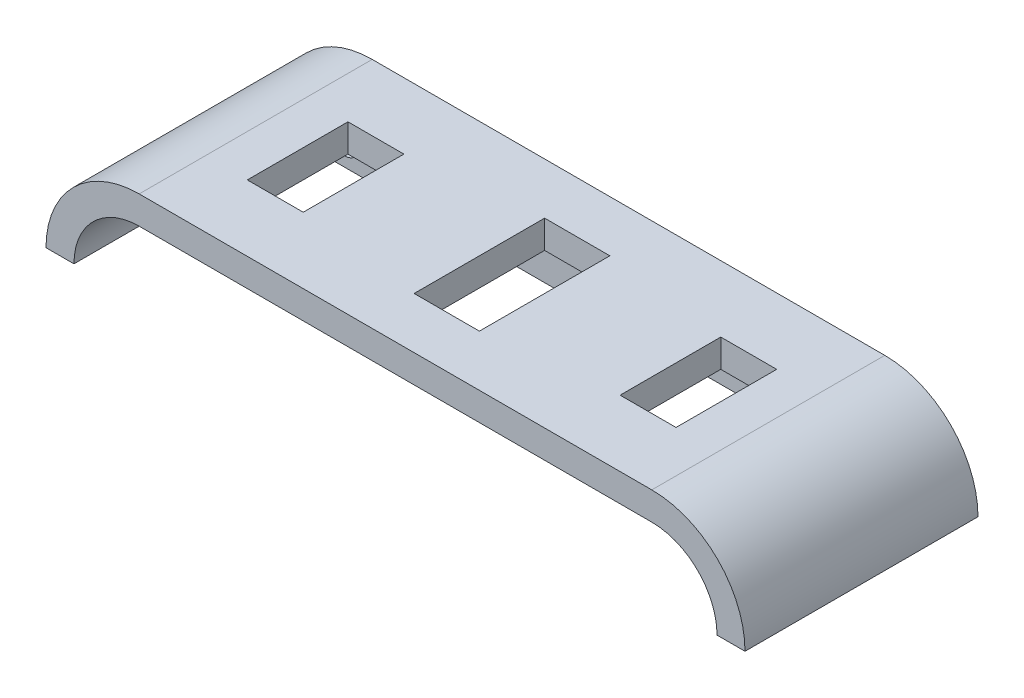
ISO-10303-21;
HEADER;
FILE_DESCRIPTION(('STEP AP214'),'2;1');
FILE_NAME('part.step','',(''),(''),'','','');
FILE_SCHEMA(('AUTOMOTIVE_DESIGN { 1 0 10303 214 1 1 1 1 }'));
ENDSEC;
DATA;
#1=APPLICATION_CONTEXT('core data for automotive mechanical design processes');
#2=APPLICATION_PROTOCOL_DEFINITION('international standard','automotive_design',2000,#1);
#3=PRODUCT_CONTEXT('',#1,'mechanical');
#4=PRODUCT('Part','Part','',(#3));
#5=PRODUCT_RELATED_PRODUCT_CATEGORY('part','',(#4));
#6=PRODUCT_DEFINITION_FORMATION('','',#4);
#7=PRODUCT_DEFINITION_CONTEXT('part definition',#1,'design');
#8=PRODUCT_DEFINITION('design','',#6,#7);
#9=PRODUCT_DEFINITION_SHAPE('','',#8);
#10=(LENGTH_UNIT() NAMED_UNIT(*) SI_UNIT(.MILLI.,.METRE.));
#11=(NAMED_UNIT(*) PLANE_ANGLE_UNIT() SI_UNIT($,.RADIAN.));
#12=(NAMED_UNIT(*) SI_UNIT($,.STERADIAN.) SOLID_ANGLE_UNIT());
#13=UNCERTAINTY_MEASURE_WITH_UNIT(LENGTH_MEASURE(1.E-05),#10,'distance_accuracy_value','');
#14=(GEOMETRIC_REPRESENTATION_CONTEXT(3) GLOBAL_UNCERTAINTY_ASSIGNED_CONTEXT((#13)) GLOBAL_UNIT_ASSIGNED_CONTEXT((#10,
#11,#12)) REPRESENTATION_CONTEXT('',''));
#15=CARTESIAN_POINT('',(0.,0.,0.));
#16=DIRECTION('',(0.,0.,1.));
#17=DIRECTION('',(1.,0.,0.));
#18=AXIS2_PLACEMENT_3D('',#15,#16,#17);
#19=CARTESIAN_POINT('',(-54.2252173913044,6.45366459627332,25.));
#20=DIRECTION('',(0.,0.,-1.));
#21=DIRECTION('',(-1.,0.,0.));
#22=AXIS2_PLACEMENT_3D('',#19,#20,#21);
#23=CYLINDRICAL_SURFACE('',#22,6.99999999999996);
#24=DIRECTION('',(0.,0.,-1.));
#25=VECTOR('',#24,1.);
#26=CARTESIAN_POINT('',(-61.062614556893,7.9536645962733,3.));
#27=LINE('',#26,#25);
#28=CARTESIAN_POINT('',(-61.062614556893,7.9536645962733,3.));
#29=VERTEX_POINT('',#28);
#30=CARTESIAN_POINT('',(-61.062614556893,7.9536645962733,0.));
#31=VERTEX_POINT('',#30);
#32=EDGE_CURVE('E309',#29,#31,#27,.T.);
#33=ORIENTED_EDGE('',*,*,#32,.F.);
#34=CARTESIAN_POINT('',(-54.2252173913044,6.45366459627332,3.));
#35=DIRECTION('',(0.,0.,1.));
#36=DIRECTION('',(-1.,0.,0.));
#37=AXIS2_PLACEMENT_3D('',#34,#35,#36);
#38=CIRCLE('',#37,6.99999999999997);
#39=CARTESIAN_POINT('',(-54.2252173913044,13.4536645962733,3.));
#40=VERTEX_POINT('',#39);
#41=EDGE_CURVE('E293',#40,#29,#38,.T.);
#42=ORIENTED_EDGE('',*,*,#41,.F.);
#43=DIRECTION('',(0.,0.,-1.));
#44=VECTOR('',#43,1.);
#45=CARTESIAN_POINT('',(-54.2252173913044,13.4536645962733,25.));
#46=LINE('',#45,#44);
#47=CARTESIAN_POINT('',(-54.2252173913044,13.4536645962733,25.));
#48=VERTEX_POINT('',#47);
#49=EDGE_CURVE('E359',#48,#40,#46,.T.);
#50=ORIENTED_EDGE('',*,*,#49,.F.);
#51=CARTESIAN_POINT('',(-54.2252173913044,6.45366459627332,25.));
#52=DIRECTION('',(0.,0.,-1.));
#53=DIRECTION('',(-1.,0.,0.));
#54=AXIS2_PLACEMENT_3D('',#51,#52,#53);
#55=CIRCLE('',#54,6.99999999999996);
#56=CARTESIAN_POINT('',(-61.2252173913044,6.45366459627331,25.));
#57=VERTEX_POINT('',#56);
#58=EDGE_CURVE('E319',#57,#48,#55,.T.);
#59=ORIENTED_EDGE('',*,*,#58,.F.);
#60=DIRECTION('',(0.,0.,-1.));
#61=VECTOR('',#60,1.);
#62=CARTESIAN_POINT('',(-61.2252173913044,6.45366459627331,25.));
#63=LINE('',#62,#61);
#64=CARTESIAN_POINT('',(-61.2252173913044,6.45366459627331,0.));
#65=VERTEX_POINT('',#64);
#66=EDGE_CURVE('E48',#57,#65,#63,.T.);
#67=ORIENTED_EDGE('',*,*,#66,.T.);
#68=CARTESIAN_POINT('',(-54.2252173913044,6.45366459627332,0.));
#69=DIRECTION('',(0.,0.,-1.));
#70=DIRECTION('',(-1.,0.,0.));
#71=AXIS2_PLACEMENT_3D('',#68,#69,#70);
#72=CIRCLE('',#71,6.99999999999996);
#73=EDGE_CURVE('E336',#65,#31,#72,.T.);
#74=ORIENTED_EDGE('',*,*,#73,.T.);
#75=EDGE_LOOP('',(#33,#42,#50,#59,#67,#74));
#76=FACE_BOUND('',#75,.T.);
#77=ADVANCED_FACE('F39',(#76),#23,.F.);
#78=CARTESIAN_POINT('',(-54.2252173913044,13.4536645962733,25.));
#79=DIRECTION('',(0.,1.,0.));
#80=DIRECTION('',(0.,0.,1.));
#81=AXIS2_PLACEMENT_3D('',#78,#79,#80);
#82=PLANE('',#81);
#83=DIRECTION('',(-1.,0.,0.));
#84=VECTOR('',#83,1.);
#85=CARTESIAN_POINT('',(-54.2252173913044,13.4536645962733,7.1));
#86=LINE('',#85,#84);
#87=CARTESIAN_POINT('',(-3.72521739130438,13.4536645962733,7.1));
#88=VERTEX_POINT('',#87);
#89=CARTESIAN_POINT('',(-9.72521739130438,13.4536645962733,7.1));
#90=VERTEX_POINT('',#89);
#91=EDGE_CURVE('E286',#88,#90,#86,.T.);
#92=ORIENTED_EDGE('',*,*,#91,.T.);
#93=DIRECTION('',(0.,0.,1.));
#94=VECTOR('',#93,1.);
#95=CARTESIAN_POINT('',(-9.72521739130438,13.4536645962733,25.));
#96=LINE('',#95,#94);
#97=CARTESIAN_POINT('',(-9.72521739130438,13.4536645962733,17.9));
#98=VERTEX_POINT('',#97);
#99=EDGE_CURVE('E289',#90,#98,#96,.T.);
#100=ORIENTED_EDGE('',*,*,#99,.T.);
#101=DIRECTION('',(1.,0.,0.));
#102=VECTOR('',#101,1.);
#103=CARTESIAN_POINT('',(-54.2252173913044,13.4536645962733,17.9));
#104=LINE('',#103,#102);
#105=CARTESIAN_POINT('',(-3.72521739130438,13.4536645962733,17.9));
#106=VERTEX_POINT('',#105);
#107=EDGE_CURVE('E283',#98,#106,#104,.T.);
#108=ORIENTED_EDGE('',*,*,#107,.T.);
#109=DIRECTION('',(0.,0.,-1.));
#110=VECTOR('',#109,1.);
#111=CARTESIAN_POINT('',(-3.72521739130438,13.4536645962733,25.));
#112=LINE('',#111,#110);
#113=EDGE_CURVE('E195',#106,#88,#112,.T.);
#114=ORIENTED_EDGE('',*,*,#113,.T.);
#115=EDGE_LOOP('',(#92,#100,#108,#114));
#116=FACE_BOUND('',#115,.T.);
#117=DIRECTION('',(-1.,0.,0.));
#118=VECTOR('',#117,1.);
#119=CARTESIAN_POINT('',(-54.2252173913044,13.4536645962733,7.1));
#120=LINE('',#119,#118);
#121=CARTESIAN_POINT('',(-43.7252173913044,13.4536645962733,7.1));
#122=VERTEX_POINT('',#121);
#123=CARTESIAN_POINT('',(-49.7252173913044,13.4536645962733,7.1));
#124=VERTEX_POINT('',#123);
#125=EDGE_CURVE('E277',#122,#124,#120,.T.);
#126=ORIENTED_EDGE('',*,*,#125,.T.);
#127=DIRECTION('',(0.,0.,1.));
#128=VECTOR('',#127,1.);
#129=CARTESIAN_POINT('',(-49.7252173913044,13.4536645962733,25.));
#130=LINE('',#129,#128);
#131=CARTESIAN_POINT('',(-49.7252173913044,13.4536645962733,17.9));
#132=VERTEX_POINT('',#131);
#133=EDGE_CURVE('E280',#124,#132,#130,.T.);
#134=ORIENTED_EDGE('',*,*,#133,.T.);
#135=DIRECTION('',(1.,0.,0.));
#136=VECTOR('',#135,1.);
#137=CARTESIAN_POINT('',(-54.2252173913044,13.4536645962733,17.9));
#138=LINE('',#137,#136);
#139=CARTESIAN_POINT('',(-43.7252173913044,13.4536645962733,17.9));
#140=VERTEX_POINT('',#139);
#141=EDGE_CURVE('E271',#132,#140,#138,.T.);
#142=ORIENTED_EDGE('',*,*,#141,.T.);
#143=DIRECTION('',(0.,0.,-1.));
#144=VECTOR('',#143,1.);
#145=CARTESIAN_POINT('',(-43.7252173913044,13.4536645962733,25.));
#146=LINE('',#145,#144);
#147=EDGE_CURVE('E274',#140,#122,#146,.T.);
#148=ORIENTED_EDGE('',*,*,#147,.T.);
#149=EDGE_LOOP('',(#126,#134,#142,#148));
#150=FACE_BOUND('',#149,.T.);
#151=DIRECTION('',(-1.,0.,0.));
#152=VECTOR('',#151,1.);
#153=CARTESIAN_POINT('',(-54.2252173913044,13.4536645962733,5.50000000000001));
#154=LINE('',#153,#152);
#155=CARTESIAN_POINT('',(-23.2252173913044,13.4536645962733,5.50000000000001));
#156=VERTEX_POINT('',#155);
#157=CARTESIAN_POINT('',(-30.2252173913044,13.4536645962733,5.50000000000001));
#158=VERTEX_POINT('',#157);
#159=EDGE_CURVE('E265',#156,#158,#154,.T.);
#160=ORIENTED_EDGE('',*,*,#159,.T.);
#161=DIRECTION('',(0.,0.,1.));
#162=VECTOR('',#161,1.);
#163=CARTESIAN_POINT('',(-30.2252173913044,13.4536645962733,25.));
#164=LINE('',#163,#162);
#165=CARTESIAN_POINT('',(-30.2252173913044,13.4536645962733,19.5));
#166=VERTEX_POINT('',#165);
#167=EDGE_CURVE('E268',#158,#166,#164,.T.);
#168=ORIENTED_EDGE('',*,*,#167,.T.);
#169=DIRECTION('',(1.,0.,0.));
#170=VECTOR('',#169,1.);
#171=CARTESIAN_POINT('',(-54.2252173913044,13.4536645962733,19.5));
#172=LINE('',#171,#170);
#173=CARTESIAN_POINT('',(-23.2252173913044,13.4536645962733,19.5));
#174=VERTEX_POINT('',#173);
#175=EDGE_CURVE('E219',#166,#174,#172,.T.);
#176=ORIENTED_EDGE('',*,*,#175,.T.);
#177=DIRECTION('',(0.,0.,-1.));
#178=VECTOR('',#177,1.);
#179=CARTESIAN_POINT('',(-23.2252173913044,13.4536645962733,25.));
#180=LINE('',#179,#178);
#181=EDGE_CURVE('E262',#174,#156,#180,.T.);
#182=ORIENTED_EDGE('',*,*,#181,.T.);
#183=EDGE_LOOP('',(#160,#168,#176,#182));
#184=FACE_BOUND('',#183,.T.);
#185=DIRECTION('',(-1.,0.,0.));
#186=VECTOR('',#185,1.);
#187=CARTESIAN_POINT('',(-54.2252173913044,13.4536645962733,3.));
#188=LINE('',#187,#186);
#189=CARTESIAN_POINT('',(0.774782608695637,13.4536645962733,3.));
#190=VERTEX_POINT('',#189);
#191=EDGE_CURVE('E302',#190,#40,#188,.T.);
#192=ORIENTED_EDGE('',*,*,#191,.F.);
#193=DIRECTION('',(0.,0.,-1.));
#194=VECTOR('',#193,1.);
#195=CARTESIAN_POINT('',(0.774782608695637,13.4536645962733,25.));
#196=LINE('',#195,#194);
#197=CARTESIAN_POINT('',(0.774782608695637,13.4536645962733,25.));
#198=VERTEX_POINT('',#197);
#199=EDGE_CURVE('E356',#198,#190,#196,.T.);
#200=ORIENTED_EDGE('',*,*,#199,.F.);
#201=DIRECTION('',(1.,0.,0.));
#202=VECTOR('',#201,1.);
#203=CARTESIAN_POINT('',(-54.2252173913044,13.4536645962733,25.));
#204=LINE('',#203,#202);
#205=EDGE_CURVE('E321',#48,#198,#204,.T.);
#206=ORIENTED_EDGE('',*,*,#205,.F.);
#207=ORIENTED_EDGE('',*,*,#49,.T.);
#208=EDGE_LOOP('',(#192,#200,#206,#207));
#209=FACE_BOUND('',#208,.T.);
#210=ADVANCED_FACE('F389',(#116,#150,#184,#209),#82,.F.);
#211=CARTESIAN_POINT('',(0.77478260869563,6.45366459627325,25.));
#212=DIRECTION('',(0.,0.,-1.));
#213=DIRECTION('',(-1.,0.,0.));
#214=AXIS2_PLACEMENT_3D('',#211,#212,#213);
#215=CYLINDRICAL_SURFACE('',#214,7.00000000000003);
#216=DIRECTION('',(0.,0.,-1.));
#217=VECTOR('',#216,1.);
#218=CARTESIAN_POINT('',(7.61217977428432,7.9536645962733,3.));
#219=LINE('',#218,#217);
#220=CARTESIAN_POINT('',(7.61217977428432,7.9536645962733,3.));
#221=VERTEX_POINT('',#220);
#222=CARTESIAN_POINT('',(7.61217977428432,7.9536645962733,0.));
#223=VERTEX_POINT('',#222);
#224=EDGE_CURVE('E305',#221,#223,#219,.T.);
#225=ORIENTED_EDGE('',*,*,#224,.T.);
#226=CARTESIAN_POINT('',(0.77478260869563,6.45366459627325,0.));
#227=DIRECTION('',(0.,0.,-1.));
#228=DIRECTION('',(1.,0.,0.));
#229=AXIS2_PLACEMENT_3D('',#226,#227,#228);
#230=CIRCLE('',#229,7.00000000000003);
#231=CARTESIAN_POINT('',(7.77478260869566,6.45366459627329,0.));
#232=VERTEX_POINT('',#231);
#233=EDGE_CURVE('E338',#223,#232,#230,.T.);
#234=ORIENTED_EDGE('',*,*,#233,.T.);
#235=DIRECTION('',(0.,0.,-1.));
#236=VECTOR('',#235,1.);
#237=CARTESIAN_POINT('',(7.77478260869566,6.45366459627329,25.));
#238=LINE('',#237,#236);
#239=CARTESIAN_POINT('',(7.77478260869566,6.45366459627329,25.));
#240=VERTEX_POINT('',#239);
#241=EDGE_CURVE('E353',#240,#232,#238,.T.);
#242=ORIENTED_EDGE('',*,*,#241,.F.);
#243=CARTESIAN_POINT('',(0.77478260869563,6.45366459627325,25.));
#244=DIRECTION('',(0.,0.,-1.));
#245=DIRECTION('',(1.,0.,0.));
#246=AXIS2_PLACEMENT_3D('',#243,#244,#245);
#247=CIRCLE('',#246,7.00000000000003);
#248=EDGE_CURVE('E323',#198,#240,#247,.T.);
#249=ORIENTED_EDGE('',*,*,#248,.F.);
#250=ORIENTED_EDGE('',*,*,#199,.T.);
#251=CARTESIAN_POINT('',(0.77478260869563,6.45366459627325,3.));
#252=DIRECTION('',(0.,0.,1.));
#253=DIRECTION('',(1.,0.,0.));
#254=AXIS2_PLACEMENT_3D('',#251,#252,#253);
#255=CIRCLE('',#254,7.00000000000003);
#256=EDGE_CURVE('E299',#221,#190,#255,.T.);
#257=ORIENTED_EDGE('',*,*,#256,.F.);
#258=EDGE_LOOP('',(#225,#234,#242,#249,#250,#257));
#259=FACE_BOUND('',#258,.T.);
#260=ADVANCED_FACE('F397',(#259),#215,.F.);
#261=CARTESIAN_POINT('',(-54.2252173913044,6.45366459627329,25.));
#262=DIRECTION('',(0.,0.,-1.));
#263=DIRECTION('',(-1.,0.,0.));
#264=AXIS2_PLACEMENT_3D('',#261,#262,#263);
#265=CYLINDRICAL_SURFACE('',#264,9.99999999999999);
#266=CARTESIAN_POINT('',(-54.2252173913044,6.45366459627329,0.));
#267=DIRECTION('',(0.,0.,1.));
#268=DIRECTION('',(-1.,0.,0.));
#269=AXIS2_PLACEMENT_3D('',#266,#267,#268);
#270=CIRCLE('',#269,9.99999999999999);
#271=CARTESIAN_POINT('',(-54.2252173913044,16.4536645962733,0.));
#272=VERTEX_POINT('',#271);
#273=CARTESIAN_POINT('',(-64.2252173913044,6.45366459627329,0.));
#274=VERTEX_POINT('',#273);
#275=EDGE_CURVE('E312',#272,#274,#270,.T.);
#276=ORIENTED_EDGE('',*,*,#275,.T.);
#277=DIRECTION('',(0.,0.,-1.));
#278=VECTOR('',#277,1.);
#279=CARTESIAN_POINT('',(-64.2252173913044,6.45366459627329,25.));
#280=LINE('',#279,#278);
#281=CARTESIAN_POINT('',(-64.2252173913044,6.45366459627329,25.));
#282=VERTEX_POINT('',#281);
#283=EDGE_CURVE('E11',#282,#274,#280,.T.);
#284=ORIENTED_EDGE('',*,*,#283,.F.);
#285=CARTESIAN_POINT('',(-54.2252173913044,6.45366459627329,25.));
#286=DIRECTION('',(0.,0.,1.));
#287=DIRECTION('',(-1.,0.,0.));
#288=AXIS2_PLACEMENT_3D('',#285,#286,#287);
#289=CIRCLE('',#288,9.99999999999999);
#290=CARTESIAN_POINT('',(-54.2252173913044,16.4536645962733,25.));
#291=VERTEX_POINT('',#290);
#292=EDGE_CURVE('E313',#291,#282,#289,.T.);
#293=ORIENTED_EDGE('',*,*,#292,.F.);
#294=DIRECTION('',(0.,0.,-1.));
#295=VECTOR('',#294,1.);
#296=CARTESIAN_POINT('',(-54.2252173913044,16.4536645962733,25.));
#297=LINE('',#296,#295);
#298=EDGE_CURVE('E331',#291,#272,#297,.T.);
#299=ORIENTED_EDGE('',*,*,#298,.T.);
#300=EDGE_LOOP('',(#276,#284,#293,#299));
#301=FACE_BOUND('',#300,.T.);
#302=ADVANCED_FACE('F41',(#301),#265,.T.);
#303=CARTESIAN_POINT('',(-64.2252173913044,6.45366459627329,25.));
#304=DIRECTION('',(0.,1.,0.));
#305=DIRECTION('',(-1.,0.,0.));
#306=AXIS2_PLACEMENT_3D('',#303,#304,#305);
#307=PLANE('',#306);
#308=DIRECTION('',(1.,0.,0.));
#309=VECTOR('',#308,1.);
#310=CARTESIAN_POINT('',(-64.2252173913044,6.45366459627329,0.));
#311=LINE('',#310,#309);
#312=EDGE_CURVE('E334',#274,#65,#311,.T.);
#313=ORIENTED_EDGE('',*,*,#312,.T.);
#314=ORIENTED_EDGE('',*,*,#66,.F.);
#315=DIRECTION('',(1.,0.,0.));
#316=VECTOR('',#315,1.);
#317=CARTESIAN_POINT('',(-64.2252173913044,6.45366459627329,25.));
#318=LINE('',#317,#316);
#319=EDGE_CURVE('E316',#282,#57,#318,.T.);
#320=ORIENTED_EDGE('',*,*,#319,.F.);
#321=ORIENTED_EDGE('',*,*,#283,.T.);
#322=EDGE_LOOP('',(#313,#314,#320,#321));
#323=FACE_BOUND('',#322,.T.);
#324=ADVANCED_FACE('F401',(#323),#307,.F.);
#325=CARTESIAN_POINT('',(10.7747826086957,6.45366459627329,25.));
#326=DIRECTION('',(0.,1.,0.));
#327=DIRECTION('',(0.,0.,1.));
#328=AXIS2_PLACEMENT_3D('',#325,#326,#327);
#329=PLANE('',#328);
#330=DIRECTION('',(1.,0.,0.));
#331=VECTOR('',#330,1.);
#332=CARTESIAN_POINT('',(10.7747826086957,6.45366459627329,0.));
#333=LINE('',#332,#331);
#334=CARTESIAN_POINT('',(10.7747826086957,6.45366459627329,0.));
#335=VERTEX_POINT('',#334);
#336=EDGE_CURVE('E340',#232,#335,#333,.T.);
#337=ORIENTED_EDGE('',*,*,#336,.T.);
#338=DIRECTION('',(0.,0.,-1.));
#339=VECTOR('',#338,1.);
#340=CARTESIAN_POINT('',(10.7747826086957,6.45366459627329,25.));
#341=LINE('',#340,#339);
#342=CARTESIAN_POINT('',(10.7747826086957,6.45366459627329,25.));
#343=VERTEX_POINT('',#342);
#344=EDGE_CURVE('E350',#343,#335,#341,.T.);
#345=ORIENTED_EDGE('',*,*,#344,.F.);
#346=DIRECTION('',(1.,0.,0.));
#347=VECTOR('',#346,1.);
#348=CARTESIAN_POINT('',(10.7747826086957,6.45366459627329,25.));
#349=LINE('',#348,#347);
#350=EDGE_CURVE('E325',#240,#343,#349,.T.);
#351=ORIENTED_EDGE('',*,*,#350,.F.);
#352=ORIENTED_EDGE('',*,*,#241,.T.);
#353=EDGE_LOOP('',(#337,#345,#351,#352));
#354=FACE_BOUND('',#353,.T.);
#355=ADVANCED_FACE('F403',(#354),#329,.F.);
#356=CARTESIAN_POINT('',(0.774782608695672,6.45366459627331,25.));
#357=DIRECTION('',(0.,0.,-1.));
#358=DIRECTION('',(-1.,0.,0.));
#359=AXIS2_PLACEMENT_3D('',#356,#357,#358);
#360=CYLINDRICAL_SURFACE('',#359,9.99999999999999);
#361=CARTESIAN_POINT('',(0.774782608695672,6.45366459627331,0.));
#362=DIRECTION('',(0.,0.,1.));
#363=DIRECTION('',(-1.,0.,0.));
#364=AXIS2_PLACEMENT_3D('',#361,#362,#363);
#365=CIRCLE('',#364,9.99999999999999);
#366=CARTESIAN_POINT('',(0.774782608695638,16.4536645962733,0.));
#367=VERTEX_POINT('',#366);
#368=EDGE_CURVE('E342',#335,#367,#365,.T.);
#369=ORIENTED_EDGE('',*,*,#368,.T.);
#370=DIRECTION('',(0.,0.,-1.));
#371=VECTOR('',#370,1.);
#372=CARTESIAN_POINT('',(0.774782608695638,16.4536645962733,25.));
#373=LINE('',#372,#371);
#374=CARTESIAN_POINT('',(0.774782608695638,16.4536645962733,25.));
#375=VERTEX_POINT('',#374);
#376=EDGE_CURVE('E347',#375,#367,#373,.T.);
#377=ORIENTED_EDGE('',*,*,#376,.F.);
#378=CARTESIAN_POINT('',(0.774782608695672,6.45366459627331,25.));
#379=DIRECTION('',(0.,0.,1.));
#380=DIRECTION('',(-1.,0.,0.));
#381=AXIS2_PLACEMENT_3D('',#378,#379,#380);
#382=CIRCLE('',#381,9.99999999999999);
#383=EDGE_CURVE('E327',#343,#375,#382,.T.);
#384=ORIENTED_EDGE('',*,*,#383,.F.);
#385=ORIENTED_EDGE('',*,*,#344,.T.);
#386=EDGE_LOOP('',(#369,#377,#384,#385));
#387=FACE_BOUND('',#386,.T.);
#388=ADVANCED_FACE('F409',(#387),#360,.T.);
#389=CARTESIAN_POINT('',(-54.2252173913044,16.4536645962733,25.));
#390=DIRECTION('',(0.,-1.,0.));
#391=DIRECTION('',(0.,0.,-1.));
#392=AXIS2_PLACEMENT_3D('',#389,#390,#391);
#393=PLANE('',#392);
#394=DIRECTION('',(1.,0.,0.));
#395=VECTOR('',#394,1.);
#396=CARTESIAN_POINT('',(-3.72521739130438,16.4536645962733,17.9));
#397=LINE('',#396,#395);
#398=CARTESIAN_POINT('',(-9.72521739130438,16.4536645962733,17.9));
#399=VERTEX_POINT('',#398);
#400=CARTESIAN_POINT('',(-3.72521739130438,16.4536645962733,17.9));
#401=VERTEX_POINT('',#400);
#402=EDGE_CURVE('E202',#399,#401,#397,.T.);
#403=ORIENTED_EDGE('',*,*,#402,.F.);
#404=DIRECTION('',(0.,0.,1.));
#405=VECTOR('',#404,1.);
#406=CARTESIAN_POINT('',(-9.72521739130438,16.4536645962733,7.1));
#407=LINE('',#406,#405);
#408=CARTESIAN_POINT('',(-9.72521739130438,16.4536645962733,7.1));
#409=VERTEX_POINT('',#408);
#410=EDGE_CURVE('E207',#409,#399,#407,.T.);
#411=ORIENTED_EDGE('',*,*,#410,.F.);
#412=DIRECTION('',(-1.,0.,0.));
#413=VECTOR('',#412,1.);
#414=CARTESIAN_POINT('',(-3.72521739130438,16.4536645962733,7.1));
#415=LINE('',#414,#413);
#416=CARTESIAN_POINT('',(-3.72521739130438,16.4536645962733,7.1));
#417=VERTEX_POINT('',#416);
#418=EDGE_CURVE('E212',#417,#409,#415,.T.);
#419=ORIENTED_EDGE('',*,*,#418,.F.);
#420=DIRECTION('',(0.,0.,-1.));
#421=VECTOR('',#420,1.);
#422=CARTESIAN_POINT('',(-3.72521739130438,16.4536645962733,7.1));
#423=LINE('',#422,#421);
#424=EDGE_CURVE('E192',#401,#417,#423,.T.);
#425=ORIENTED_EDGE('',*,*,#424,.F.);
#426=EDGE_LOOP('',(#403,#411,#419,#425));
#427=FACE_BOUND('',#426,.T.);
#428=DIRECTION('',(1.,0.,0.));
#429=VECTOR('',#428,1.);
#430=CARTESIAN_POINT('',(-49.7252173913044,16.4536645962733,17.9));
#431=LINE('',#430,#429);
#432=CARTESIAN_POINT('',(-49.7252173913044,16.4536645962733,17.9));
#433=VERTEX_POINT('',#432);
#434=CARTESIAN_POINT('',(-43.7252173913044,16.4536645962733,17.9));
#435=VERTEX_POINT('',#434);
#436=EDGE_CURVE('E237',#433,#435,#431,.T.);
#437=ORIENTED_EDGE('',*,*,#436,.F.);
#438=DIRECTION('',(0.,0.,1.));
#439=VECTOR('',#438,1.);
#440=CARTESIAN_POINT('',(-49.7252173913044,16.4536645962733,7.1));
#441=LINE('',#440,#439);
#442=CARTESIAN_POINT('',(-49.7252173913044,16.4536645962733,7.1));
#443=VERTEX_POINT('',#442);
#444=EDGE_CURVE('E239',#443,#433,#441,.T.);
#445=ORIENTED_EDGE('',*,*,#444,.F.);
#446=DIRECTION('',(-1.,0.,0.));
#447=VECTOR('',#446,1.);
#448=CARTESIAN_POINT('',(-49.7252173913044,16.4536645962733,7.1));
#449=LINE('',#448,#447);
#450=CARTESIAN_POINT('',(-43.7252173913044,16.4536645962733,7.1));
#451=VERTEX_POINT('',#450);
#452=EDGE_CURVE('E225',#451,#443,#449,.T.);
#453=ORIENTED_EDGE('',*,*,#452,.F.);
#454=DIRECTION('',(0.,0.,-1.));
#455=VECTOR('',#454,1.);
#456=CARTESIAN_POINT('',(-43.7252173913044,16.4536645962733,7.1));
#457=LINE('',#456,#455);
#458=EDGE_CURVE('E234',#435,#451,#457,.T.);
#459=ORIENTED_EDGE('',*,*,#458,.F.);
#460=EDGE_LOOP('',(#437,#445,#453,#459));
#461=FACE_BOUND('',#460,.T.);
#462=DIRECTION('',(1.,0.,0.));
#463=VECTOR('',#462,1.);
#464=CARTESIAN_POINT('',(-23.2252173913044,16.4536645962733,19.5));
#465=LINE('',#464,#463);
#466=CARTESIAN_POINT('',(-30.2252173913044,16.4536645962733,19.5));
#467=VERTEX_POINT('',#466);
#468=CARTESIAN_POINT('',(-23.2252173913044,16.4536645962733,19.5));
#469=VERTEX_POINT('',#468);
#470=EDGE_CURVE('E256',#467,#469,#465,.T.);
#471=ORIENTED_EDGE('',*,*,#470,.F.);
#472=DIRECTION('',(0.,0.,1.));
#473=VECTOR('',#472,1.);
#474=CARTESIAN_POINT('',(-30.2252173913044,16.4536645962733,5.50000000000001));
#475=LINE('',#474,#473);
#476=CARTESIAN_POINT('',(-30.2252173913044,16.4536645962733,5.50000000000001));
#477=VERTEX_POINT('',#476);
#478=EDGE_CURVE('E231',#477,#467,#475,.T.);
#479=ORIENTED_EDGE('',*,*,#478,.F.);
#480=DIRECTION('',(-1.,0.,0.));
#481=VECTOR('',#480,1.);
#482=CARTESIAN_POINT('',(-23.2252173913044,16.4536645962733,5.50000000000001));
#483=LINE('',#482,#481);
#484=CARTESIAN_POINT('',(-23.2252173913044,16.4536645962733,5.50000000000001));
#485=VERTEX_POINT('',#484);
#486=EDGE_CURVE('E244',#485,#477,#483,.T.);
#487=ORIENTED_EDGE('',*,*,#486,.F.);
#488=DIRECTION('',(0.,0.,-1.));
#489=VECTOR('',#488,1.);
#490=CARTESIAN_POINT('',(-23.2252173913044,16.4536645962733,5.50000000000001));
#491=LINE('',#490,#489);
#492=EDGE_CURVE('E253',#469,#485,#491,.T.);
#493=ORIENTED_EDGE('',*,*,#492,.F.);
#494=EDGE_LOOP('',(#471,#479,#487,#493));
#495=FACE_BOUND('',#494,.T.);
#496=DIRECTION('',(-1.,0.,0.));
#497=VECTOR('',#496,1.);
#498=CARTESIAN_POINT('',(-54.2252173913044,16.4536645962733,0.));
#499=LINE('',#498,#497);
#500=EDGE_CURVE('E317',#367,#272,#499,.T.);
#501=ORIENTED_EDGE('',*,*,#500,.T.);
#502=ORIENTED_EDGE('',*,*,#298,.F.);
#503=DIRECTION('',(-1.,0.,0.));
#504=VECTOR('',#503,1.);
#505=CARTESIAN_POINT('',(-54.2252173913044,16.4536645962733,25.));
#506=LINE('',#505,#504);
#507=EDGE_CURVE('E329',#375,#291,#506,.T.);
#508=ORIENTED_EDGE('',*,*,#507,.F.);
#509=ORIENTED_EDGE('',*,*,#376,.T.);
#510=EDGE_LOOP('',(#501,#502,#508,#509));
#511=FACE_BOUND('',#510,.T.);
#512=ADVANCED_FACE('F209',(#427,#461,#495,#511),#393,.F.);
#513=CARTESIAN_POINT('',(-54.2252173913044,6.45366459627329,25.));
#514=DIRECTION('',(0.,0.,-1.));
#515=DIRECTION('',(-1.,0.,0.));
#516=AXIS2_PLACEMENT_3D('',#513,#514,#515);
#517=PLANE('',#516);
#518=ORIENTED_EDGE('',*,*,#292,.T.);
#519=ORIENTED_EDGE('',*,*,#319,.T.);
#520=ORIENTED_EDGE('',*,*,#58,.T.);
#521=ORIENTED_EDGE('',*,*,#205,.T.);
#522=ORIENTED_EDGE('',*,*,#248,.T.);
#523=ORIENTED_EDGE('',*,*,#350,.T.);
#524=ORIENTED_EDGE('',*,*,#383,.T.);
#525=ORIENTED_EDGE('',*,*,#507,.T.);
#526=EDGE_LOOP('',(#518,#519,#520,#521,#522,#523,#524,#525));
#527=FACE_BOUND('',#526,.T.);
#528=ADVANCED_FACE('F437',(#527),#517,.F.);
#529=CARTESIAN_POINT('',(-54.2252173913044,6.45366459627329,0.));
#530=DIRECTION('',(0.,0.,-1.));
#531=DIRECTION('',(-1.,0.,0.));
#532=AXIS2_PLACEMENT_3D('',#529,#530,#531);
#533=PLANE('',#532);
#534=CARTESIAN_POINT('',(-54.2252173913044,10.7036645962733,0.));
#535=DIRECTION('',(0.,0.,-1.));
#536=DIRECTION('',(-1.,0.,0.));
#537=AXIS2_PLACEMENT_3D('',#534,#535,#536);
#538=CIRCLE('',#537,1.7);
#539=CARTESIAN_POINT('',(-55.9252173913044,10.7036645962733,0.));
#540=VERTEX_POINT('',#539);
#541=EDGE_CURVE('E367',#540,#540,#538,.T.);
#542=ORIENTED_EDGE('',*,*,#541,.F.);
#543=EDGE_LOOP('',(#542));
#544=FACE_BOUND('',#543,.T.);
#545=CARTESIAN_POINT('',(0.774782608695623,10.7036645962736,0.));
#546=DIRECTION('',(0.,0.,-1.));
#547=DIRECTION('',(1.,0.,0.));
#548=AXIS2_PLACEMENT_3D('',#545,#546,#547);
#549=CIRCLE('',#548,1.7);
#550=CARTESIAN_POINT('',(2.47478260869563,10.7036645962736,0.));
#551=VERTEX_POINT('',#550);
#552=EDGE_CURVE('E672',#551,#551,#549,.T.);
#553=ORIENTED_EDGE('',*,*,#552,.F.);
#554=EDGE_LOOP('',(#553));
#555=FACE_BOUND('',#554,.T.);
#556=CARTESIAN_POINT('',(-26.7252173913044,10.7036645962733,0.));
#557=DIRECTION('',(0.,0.,-1.));
#558=DIRECTION('',(-1.,0.,0.));
#559=AXIS2_PLACEMENT_3D('',#556,#557,#558);
#560=CIRCLE('',#559,1.7);
#561=CARTESIAN_POINT('',(-28.4252173913044,10.7036645962733,0.));
#562=VERTEX_POINT('',#561);
#563=EDGE_CURVE('E668',#562,#562,#560,.T.);
#564=ORIENTED_EDGE('',*,*,#563,.F.);
#565=EDGE_LOOP('',(#564));
#566=FACE_BOUND('',#565,.T.);
#567=DIRECTION('',(1.,0.,0.));
#568=VECTOR('',#567,1.);
#569=CARTESIAN_POINT('',(-61.062614556893,7.9536645962733,0.));
#570=LINE('',#569,#568);
#571=EDGE_CURVE('E292',#31,#223,#570,.T.);
#572=ORIENTED_EDGE('',*,*,#571,.F.);
#573=ORIENTED_EDGE('',*,*,#73,.F.);
#574=ORIENTED_EDGE('',*,*,#312,.F.);
#575=ORIENTED_EDGE('',*,*,#275,.F.);
#576=ORIENTED_EDGE('',*,*,#500,.F.);
#577=ORIENTED_EDGE('',*,*,#368,.F.);
#578=ORIENTED_EDGE('',*,*,#336,.F.);
#579=ORIENTED_EDGE('',*,*,#233,.F.);
#580=EDGE_LOOP('',(#572,#573,#574,#575,#576,#577,#578,#579));
#581=FACE_BOUND('',#580,.T.);
#582=ADVANCED_FACE('F421',(#544,#555,#566,#581),#533,.T.);
#583=CARTESIAN_POINT('',(-61.062614556893,7.9536645962733,3.));
#584=DIRECTION('',(0.,1.,0.));
#585=DIRECTION('',(0.,0.,1.));
#586=AXIS2_PLACEMENT_3D('',#583,#584,#585);
#587=PLANE('',#586);
#588=ORIENTED_EDGE('',*,*,#571,.T.);
#589=ORIENTED_EDGE('',*,*,#224,.F.);
#590=DIRECTION('',(1.,0.,0.));
#591=VECTOR('',#590,1.);
#592=CARTESIAN_POINT('',(-61.062614556893,7.9536645962733,3.));
#593=LINE('',#592,#591);
#594=EDGE_CURVE('E296',#29,#221,#593,.T.);
#595=ORIENTED_EDGE('',*,*,#594,.F.);
#596=ORIENTED_EDGE('',*,*,#32,.T.);
#597=EDGE_LOOP('',(#588,#589,#595,#596));
#598=FACE_BOUND('',#597,.T.);
#599=ADVANCED_FACE('F427',(#598),#587,.F.);
#600=CARTESIAN_POINT('',(-54.2252173913044,6.45366459627332,3.));
#601=DIRECTION('',(0.,0.,-1.));
#602=DIRECTION('',(-1.,0.,0.));
#603=AXIS2_PLACEMENT_3D('',#600,#601,#602);
#604=PLANE('',#603);
#605=CARTESIAN_POINT('',(-54.2252173913044,10.7036645962733,3.));
#606=DIRECTION('',(0.,0.,-1.));
#607=DIRECTION('',(-1.,0.,0.));
#608=AXIS2_PLACEMENT_3D('',#605,#606,#607);
#609=CIRCLE('',#608,1.7);
#610=CARTESIAN_POINT('',(-55.9252173913044,10.7036645962733,3.));
#611=VERTEX_POINT('',#610);
#612=EDGE_CURVE('E43',#611,#611,#609,.T.);
#613=ORIENTED_EDGE('',*,*,#612,.T.);
#614=EDGE_LOOP('',(#613));
#615=FACE_BOUND('',#614,.T.);
#616=CARTESIAN_POINT('',(0.774782608695623,10.7036645962736,3.));
#617=DIRECTION('',(0.,0.,-1.));
#618=DIRECTION('',(-1.,0.,0.));
#619=AXIS2_PLACEMENT_3D('',#616,#617,#618);
#620=CIRCLE('',#619,1.7);
#621=CARTESIAN_POINT('',(-0.925217391304381,10.7036645962736,3.));
#622=VERTEX_POINT('',#621);
#623=EDGE_CURVE('E366',#622,#622,#620,.T.);
#624=ORIENTED_EDGE('',*,*,#623,.T.);
#625=EDGE_LOOP('',(#624));
#626=FACE_BOUND('',#625,.T.);
#627=CARTESIAN_POINT('',(-26.7252173913044,10.7036645962733,3.));
#628=DIRECTION('',(0.,0.,-1.));
#629=DIRECTION('',(-1.,0.,0.));
#630=AXIS2_PLACEMENT_3D('',#627,#628,#629);
#631=CIRCLE('',#630,1.7);
#632=CARTESIAN_POINT('',(-28.4252173913044,10.7036645962733,3.));
#633=VERTEX_POINT('',#632);
#634=EDGE_CURVE('E364',#633,#633,#631,.T.);
#635=ORIENTED_EDGE('',*,*,#634,.T.);
#636=EDGE_LOOP('',(#635));
#637=FACE_BOUND('',#636,.T.);
#638=ORIENTED_EDGE('',*,*,#41,.T.);
#639=ORIENTED_EDGE('',*,*,#594,.T.);
#640=ORIENTED_EDGE('',*,*,#256,.T.);
#641=ORIENTED_EDGE('',*,*,#191,.T.);
#642=EDGE_LOOP('',(#638,#639,#640,#641));
#643=FACE_BOUND('',#642,.T.);
#644=ADVANCED_FACE('F374',(#615,#626,#637,#643),#604,.F.);
#645=CARTESIAN_POINT('',(-30.2252173913044,3.45366459627329,5.50000000000001));
#646=DIRECTION('',(-1.,0.,0.));
#647=DIRECTION('',(0.,0.,1.));
#648=AXIS2_PLACEMENT_3D('',#645,#646,#647);
#649=PLANE('',#648);
#650=DIRECTION('',(0.,1.,0.));
#651=VECTOR('',#650,1.);
#652=CARTESIAN_POINT('',(-30.2252173913044,3.45366459627329,5.50000000000001));
#653=LINE('',#652,#651);
#654=EDGE_CURVE('E249',#158,#477,#653,.T.);
#655=ORIENTED_EDGE('',*,*,#654,.T.);
#656=ORIENTED_EDGE('',*,*,#478,.T.);
#657=DIRECTION('',(0.,1.,0.));
#658=VECTOR('',#657,1.);
#659=CARTESIAN_POINT('',(-30.2252173913044,3.45366459627329,19.5));
#660=LINE('',#659,#658);
#661=EDGE_CURVE('E241',#166,#467,#660,.T.);
#662=ORIENTED_EDGE('',*,*,#661,.F.);
#663=ORIENTED_EDGE('',*,*,#167,.F.);
#664=EDGE_LOOP('',(#655,#656,#662,#663));
#665=FACE_BOUND('',#664,.T.);
#666=ADVANCED_FACE('F480',(#665),#649,.F.);
#667=CARTESIAN_POINT('',(-23.2252173913044,3.45366459627329,5.50000000000001));
#668=DIRECTION('',(0.,0.,-1.));
#669=DIRECTION('',(-1.,0.,0.));
#670=AXIS2_PLACEMENT_3D('',#667,#668,#669);
#671=PLANE('',#670);
#672=DIRECTION('',(0.,1.,0.));
#673=VECTOR('',#672,1.);
#674=CARTESIAN_POINT('',(-23.2252173913044,3.45366459627329,5.50000000000001));
#675=LINE('',#674,#673);
#676=EDGE_CURVE('E247',#156,#485,#675,.T.);
#677=ORIENTED_EDGE('',*,*,#676,.T.);
#678=ORIENTED_EDGE('',*,*,#486,.T.);
#679=ORIENTED_EDGE('',*,*,#654,.F.);
#680=ORIENTED_EDGE('',*,*,#159,.F.);
#681=EDGE_LOOP('',(#677,#678,#679,#680));
#682=FACE_BOUND('',#681,.T.);
#683=ADVANCED_FACE('F484',(#682),#671,.F.);
#684=CARTESIAN_POINT('',(-23.2252173913044,3.45366459627329,5.50000000000001));
#685=DIRECTION('',(1.,0.,0.));
#686=DIRECTION('',(0.,0.,-1.));
#687=AXIS2_PLACEMENT_3D('',#684,#685,#686);
#688=PLANE('',#687);
#689=DIRECTION('',(0.,1.,0.));
#690=VECTOR('',#689,1.);
#691=CARTESIAN_POINT('',(-23.2252173913044,3.45366459627329,19.5));
#692=LINE('',#691,#690);
#693=EDGE_CURVE('E245',#174,#469,#692,.T.);
#694=ORIENTED_EDGE('',*,*,#693,.T.);
#695=ORIENTED_EDGE('',*,*,#492,.T.);
#696=ORIENTED_EDGE('',*,*,#676,.F.);
#697=ORIENTED_EDGE('',*,*,#181,.F.);
#698=EDGE_LOOP('',(#694,#695,#696,#697));
#699=FACE_BOUND('',#698,.T.);
#700=ADVANCED_FACE('F493',(#699),#688,.F.);
#701=CARTESIAN_POINT('',(-23.2252173913044,3.45366459627329,19.5));
#702=DIRECTION('',(0.,0.,1.));
#703=DIRECTION('',(1.,0.,0.));
#704=AXIS2_PLACEMENT_3D('',#701,#702,#703);
#705=PLANE('',#704);
#706=ORIENTED_EDGE('',*,*,#661,.T.);
#707=ORIENTED_EDGE('',*,*,#470,.T.);
#708=ORIENTED_EDGE('',*,*,#693,.F.);
#709=ORIENTED_EDGE('',*,*,#175,.F.);
#710=EDGE_LOOP('',(#706,#707,#708,#709));
#711=FACE_BOUND('',#710,.T.);
#712=ADVANCED_FACE('F502',(#711),#705,.F.);
#713=CARTESIAN_POINT('',(-49.7252173913044,3.45366459627329,7.1));
#714=DIRECTION('',(-1.,0.,0.));
#715=DIRECTION('',(0.,0.,1.));
#716=AXIS2_PLACEMENT_3D('',#713,#714,#715);
#717=PLANE('',#716);
#718=DIRECTION('',(0.,1.,0.));
#719=VECTOR('',#718,1.);
#720=CARTESIAN_POINT('',(-49.7252173913044,3.45366459627329,7.1));
#721=LINE('',#720,#719);
#722=EDGE_CURVE('E229',#124,#443,#721,.T.);
#723=ORIENTED_EDGE('',*,*,#722,.T.);
#724=ORIENTED_EDGE('',*,*,#444,.T.);
#725=DIRECTION('',(0.,1.,0.));
#726=VECTOR('',#725,1.);
#727=CARTESIAN_POINT('',(-49.7252173913044,3.45366459627329,17.9));
#728=LINE('',#727,#726);
#729=EDGE_CURVE('E222',#132,#433,#728,.T.);
#730=ORIENTED_EDGE('',*,*,#729,.F.);
#731=ORIENTED_EDGE('',*,*,#133,.F.);
#732=EDGE_LOOP('',(#723,#724,#730,#731));
#733=FACE_BOUND('',#732,.T.);
#734=ADVANCED_FACE('F511',(#733),#717,.F.);
#735=CARTESIAN_POINT('',(-49.7252173913044,3.45366459627329,7.1));
#736=DIRECTION('',(0.,0.,-1.));
#737=DIRECTION('',(-1.,0.,0.));
#738=AXIS2_PLACEMENT_3D('',#735,#736,#737);
#739=PLANE('',#738);
#740=DIRECTION('',(0.,1.,0.));
#741=VECTOR('',#740,1.);
#742=CARTESIAN_POINT('',(-43.7252173913044,3.45366459627329,7.1));
#743=LINE('',#742,#741);
#744=EDGE_CURVE('E227',#122,#451,#743,.T.);
#745=ORIENTED_EDGE('',*,*,#744,.T.);
#746=ORIENTED_EDGE('',*,*,#452,.T.);
#747=ORIENTED_EDGE('',*,*,#722,.F.);
#748=ORIENTED_EDGE('',*,*,#125,.F.);
#749=EDGE_LOOP('',(#745,#746,#747,#748));
#750=FACE_BOUND('',#749,.T.);
#751=ADVANCED_FACE('F520',(#750),#739,.F.);
#752=CARTESIAN_POINT('',(-43.7252173913044,3.45366459627329,7.1));
#753=DIRECTION('',(1.,0.,0.));
#754=DIRECTION('',(0.,0.,-1.));
#755=AXIS2_PLACEMENT_3D('',#752,#753,#754);
#756=PLANE('',#755);
#757=DIRECTION('',(0.,1.,0.));
#758=VECTOR('',#757,1.);
#759=CARTESIAN_POINT('',(-43.7252173913044,3.45366459627329,17.9));
#760=LINE('',#759,#758);
#761=EDGE_CURVE('E64',#140,#435,#760,.T.);
#762=ORIENTED_EDGE('',*,*,#761,.T.);
#763=ORIENTED_EDGE('',*,*,#458,.T.);
#764=ORIENTED_EDGE('',*,*,#744,.F.);
#765=ORIENTED_EDGE('',*,*,#147,.F.);
#766=EDGE_LOOP('',(#762,#763,#764,#765));
#767=FACE_BOUND('',#766,.T.);
#768=ADVANCED_FACE('F529',(#767),#756,.F.);
#769=CARTESIAN_POINT('',(-49.7252173913044,3.45366459627329,17.9));
#770=DIRECTION('',(0.,0.,1.));
#771=DIRECTION('',(1.,0.,0.));
#772=AXIS2_PLACEMENT_3D('',#769,#770,#771);
#773=PLANE('',#772);
#774=ORIENTED_EDGE('',*,*,#729,.T.);
#775=ORIENTED_EDGE('',*,*,#436,.T.);
#776=ORIENTED_EDGE('',*,*,#761,.F.);
#777=ORIENTED_EDGE('',*,*,#141,.F.);
#778=EDGE_LOOP('',(#774,#775,#776,#777));
#779=FACE_BOUND('',#778,.T.);
#780=ADVANCED_FACE('F538',(#779),#773,.F.);
#781=CARTESIAN_POINT('',(-9.72521739130438,3.45366459627329,7.1));
#782=DIRECTION('',(-1.,0.,0.));
#783=DIRECTION('',(0.,0.,1.));
#784=AXIS2_PLACEMENT_3D('',#781,#782,#783);
#785=PLANE('',#784);
#786=DIRECTION('',(0.,1.,0.));
#787=VECTOR('',#786,1.);
#788=CARTESIAN_POINT('',(-9.72521739130438,3.45366459627329,7.1));
#789=LINE('',#788,#787);
#790=EDGE_CURVE('E217',#90,#409,#789,.T.);
#791=ORIENTED_EDGE('',*,*,#790,.T.);
#792=ORIENTED_EDGE('',*,*,#410,.T.);
#793=DIRECTION('',(0.,1.,0.));
#794=VECTOR('',#793,1.);
#795=CARTESIAN_POINT('',(-9.72521739130438,3.45366459627329,17.9));
#796=LINE('',#795,#794);
#797=EDGE_CURVE('E198',#98,#399,#796,.T.);
#798=ORIENTED_EDGE('',*,*,#797,.F.);
#799=ORIENTED_EDGE('',*,*,#99,.F.);
#800=EDGE_LOOP('',(#791,#792,#798,#799));
#801=FACE_BOUND('',#800,.T.);
#802=ADVANCED_FACE('F547',(#801),#785,.F.);
#803=CARTESIAN_POINT('',(-3.72521739130438,3.45366459627329,7.1));
#804=DIRECTION('',(0.,0.,-1.));
#805=DIRECTION('',(-1.,0.,0.));
#806=AXIS2_PLACEMENT_3D('',#803,#804,#805);
#807=PLANE('',#806);
#808=DIRECTION('',(0.,1.,0.));
#809=VECTOR('',#808,1.);
#810=CARTESIAN_POINT('',(-3.72521739130438,3.45366459627329,7.1));
#811=LINE('',#810,#809);
#812=EDGE_CURVE('E197',#88,#417,#811,.T.);
#813=ORIENTED_EDGE('',*,*,#812,.T.);
#814=ORIENTED_EDGE('',*,*,#418,.T.);
#815=ORIENTED_EDGE('',*,*,#790,.F.);
#816=ORIENTED_EDGE('',*,*,#91,.F.);
#817=EDGE_LOOP('',(#813,#814,#815,#816));
#818=FACE_BOUND('',#817,.T.);
#819=ADVANCED_FACE('F555',(#818),#807,.F.);
#820=CARTESIAN_POINT('',(-3.72521739130438,3.45366459627329,7.1));
#821=DIRECTION('',(1.,0.,0.));
#822=DIRECTION('',(0.,0.,-1.));
#823=AXIS2_PLACEMENT_3D('',#820,#821,#822);
#824=PLANE('',#823);
#825=DIRECTION('',(0.,1.,0.));
#826=VECTOR('',#825,1.);
#827=CARTESIAN_POINT('',(-3.72521739130438,3.45366459627329,17.9));
#828=LINE('',#827,#826);
#829=EDGE_CURVE('E56',#106,#401,#828,.T.);
#830=ORIENTED_EDGE('',*,*,#829,.T.);
#831=ORIENTED_EDGE('',*,*,#424,.T.);
#832=ORIENTED_EDGE('',*,*,#812,.F.);
#833=ORIENTED_EDGE('',*,*,#113,.F.);
#834=EDGE_LOOP('',(#830,#831,#832,#833));
#835=FACE_BOUND('',#834,.T.);
#836=ADVANCED_FACE('F189',(#835),#824,.F.);
#837=CARTESIAN_POINT('',(-3.72521739130438,3.45366459627329,17.9));
#838=DIRECTION('',(0.,0.,1.));
#839=DIRECTION('',(1.,0.,0.));
#840=AXIS2_PLACEMENT_3D('',#837,#838,#839);
#841=PLANE('',#840);
#842=ORIENTED_EDGE('',*,*,#797,.T.);
#843=ORIENTED_EDGE('',*,*,#402,.T.);
#844=ORIENTED_EDGE('',*,*,#829,.F.);
#845=ORIENTED_EDGE('',*,*,#107,.F.);
#846=EDGE_LOOP('',(#842,#843,#844,#845));
#847=FACE_BOUND('',#846,.T.);
#848=ADVANCED_FACE('F203',(#847),#841,.F.);
#849=CARTESIAN_POINT('',(-26.7252173913044,10.7036645962733,13.));
#850=DIRECTION('',(0.,0.,-1.));
#851=DIRECTION('',(-1.,0.,0.));
#852=AXIS2_PLACEMENT_3D('',#849,#850,#851);
#853=CYLINDRICAL_SURFACE('',#852,1.7);
#854=ORIENTED_EDGE('',*,*,#563,.T.);
#855=EDGE_LOOP('',(#854));
#856=FACE_BOUND('',#855,.T.);
#857=ORIENTED_EDGE('',*,*,#634,.F.);
#858=EDGE_LOOP('',(#857));
#859=FACE_BOUND('',#858,.T.);
#860=ADVANCED_FACE('F384',(#856,#859),#853,.F.);
#861=CARTESIAN_POINT('',(0.774782608695623,10.7036645962736,13.));
#862=DIRECTION('',(0.,0.,-1.));
#863=DIRECTION('',(-1.,0.,0.));
#864=AXIS2_PLACEMENT_3D('',#861,#862,#863);
#865=CYLINDRICAL_SURFACE('',#864,1.7);
#866=ORIENTED_EDGE('',*,*,#552,.T.);
#867=EDGE_LOOP('',(#866));
#868=FACE_BOUND('',#867,.T.);
#869=ORIENTED_EDGE('',*,*,#623,.F.);
#870=EDGE_LOOP('',(#869));
#871=FACE_BOUND('',#870,.T.);
#872=ADVANCED_FACE('F378',(#868,#871),#865,.F.);
#873=CARTESIAN_POINT('',(-54.2252173913044,10.7036645962733,13.));
#874=DIRECTION('',(0.,0.,-1.));
#875=DIRECTION('',(-1.,0.,0.));
#876=AXIS2_PLACEMENT_3D('',#873,#874,#875);
#877=CYLINDRICAL_SURFACE('',#876,1.7);
#878=ORIENTED_EDGE('',*,*,#541,.T.);
#879=EDGE_LOOP('',(#878));
#880=FACE_BOUND('',#879,.T.);
#881=ORIENTED_EDGE('',*,*,#612,.F.);
#882=EDGE_LOOP('',(#881));
#883=FACE_BOUND('',#882,.T.);
#884=ADVANCED_FACE('F376',(#880,#883),#877,.F.);
#885=CLOSED_SHELL('',(#77,#210,#260,#302,#324,#355,#388,#512,#528,#582,#599,#644,#666,#683,#700,
#712,#734,#751,#768,#780,#802,#819,#836,#848,#860,#872,#884));
#886=MANIFOLD_SOLID_BREP('B2',#885);
#887=ADVANCED_BREP_SHAPE_REPRESENTATION('',(#18,#886),#14);
#888=SHAPE_DEFINITION_REPRESENTATION(#9,#887);
ENDSEC;
END-ISO-10303-21;
